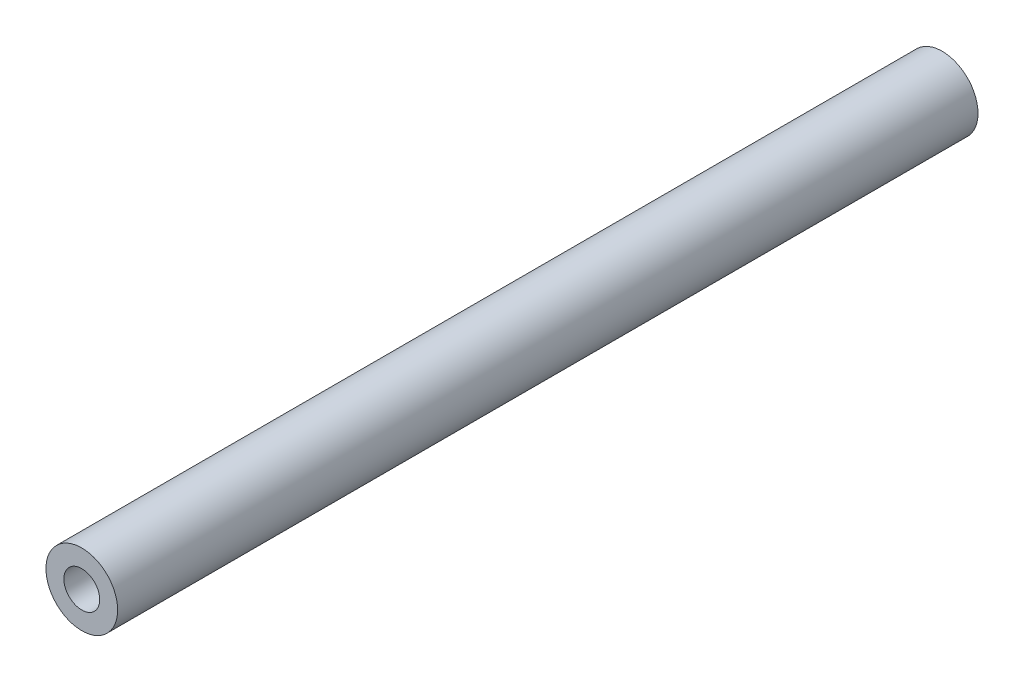
ISO-10303-21;
HEADER;
FILE_DESCRIPTION(('STEP AP214'),'2;1');
FILE_NAME('part.step','',(''),(''),'','','');
FILE_SCHEMA(('AUTOMOTIVE_DESIGN { 1 0 10303 214 1 1 1 1 }'));
ENDSEC;
DATA;
#1=APPLICATION_CONTEXT('core data for automotive mechanical design processes');
#2=APPLICATION_PROTOCOL_DEFINITION('international standard','automotive_design',2000,#1);
#3=PRODUCT_CONTEXT('',#1,'mechanical');
#4=PRODUCT('Part','Part','',(#3));
#5=PRODUCT_RELATED_PRODUCT_CATEGORY('part','',(#4));
#6=PRODUCT_DEFINITION_FORMATION('','',#4);
#7=PRODUCT_DEFINITION_CONTEXT('part definition',#1,'design');
#8=PRODUCT_DEFINITION('design','',#6,#7);
#9=PRODUCT_DEFINITION_SHAPE('','',#8);
#10=(LENGTH_UNIT() NAMED_UNIT(*) SI_UNIT(.MILLI.,.METRE.));
#11=(NAMED_UNIT(*) PLANE_ANGLE_UNIT() SI_UNIT($,.RADIAN.));
#12=(NAMED_UNIT(*) SI_UNIT($,.STERADIAN.) SOLID_ANGLE_UNIT());
#13=UNCERTAINTY_MEASURE_WITH_UNIT(LENGTH_MEASURE(1.E-05),#10,'distance_accuracy_value','');
#14=(GEOMETRIC_REPRESENTATION_CONTEXT(3) GLOBAL_UNCERTAINTY_ASSIGNED_CONTEXT((#13)) GLOBAL_UNIT_ASSIGNED_CONTEXT((#10,
#11,#12)) REPRESENTATION_CONTEXT('',''));
#15=CARTESIAN_POINT('',(0.,0.,0.));
#16=DIRECTION('',(0.,0.,1.));
#17=DIRECTION('',(1.,0.,0.));
#18=AXIS2_PLACEMENT_3D('',#15,#16,#17);
#19=CARTESIAN_POINT('',(0.,0.,100.));
#20=DIRECTION('',(0.,0.,-1.));
#21=DIRECTION('',(-1.,0.,0.));
#22=AXIS2_PLACEMENT_3D('',#19,#20,#21);
#23=CYLINDRICAL_SURFACE('',#22,10.);
#24=CARTESIAN_POINT('',(0.,0.,120.));
#25=DIRECTION('',(0.,0.,1.));
#26=DIRECTION('',(1.,0.,0.));
#27=AXIS2_PLACEMENT_3D('',#24,#25,#26);
#28=CIRCLE('',#27,10.);
#29=CARTESIAN_POINT('',(10.,0.,120.));
#30=VERTEX_POINT('',#29);
#31=EDGE_CURVE('E41',#30,#30,#28,.T.);
#32=ORIENTED_EDGE('',*,*,#31,.F.);
#33=EDGE_LOOP('',(#32));
#34=FACE_BOUND('',#33,.T.);
#35=CARTESIAN_POINT('',(0.,0.,-120.));
#36=DIRECTION('',(0.,0.,1.));
#37=DIRECTION('',(1.,0.,0.));
#38=AXIS2_PLACEMENT_3D('',#35,#36,#37);
#39=CIRCLE('',#38,10.);
#40=CARTESIAN_POINT('',(10.,0.,-120.));
#41=VERTEX_POINT('',#40);
#42=EDGE_CURVE('E50',#41,#41,#39,.T.);
#43=ORIENTED_EDGE('',*,*,#42,.T.);
#44=EDGE_LOOP('',(#43));
#45=FACE_BOUND('',#44,.T.);
#46=ADVANCED_FACE('F31',(#34,#45),#23,.T.);
#47=CARTESIAN_POINT('',(0.,0.,120.));
#48=DIRECTION('',(0.,0.,1.));
#49=DIRECTION('',(1.,0.,0.));
#50=AXIS2_PLACEMENT_3D('',#47,#48,#49);
#51=PLANE('',#50);
#52=ORIENTED_EDGE('',*,*,#31,.T.);
#53=EDGE_LOOP('',(#52));
#54=FACE_BOUND('',#53,.T.);
#55=CARTESIAN_POINT('',(0.,0.,120.));
#56=DIRECTION('',(0.,0.,1.));
#57=DIRECTION('',(1.,0.,0.));
#58=AXIS2_PLACEMENT_3D('',#55,#56,#57);
#59=CIRCLE('',#58,5.);
#60=CARTESIAN_POINT('',(5.,0.,120.));
#61=VERTEX_POINT('',#60);
#62=EDGE_CURVE('E45',#61,#61,#59,.T.);
#63=ORIENTED_EDGE('',*,*,#62,.F.);
#64=EDGE_LOOP('',(#63));
#65=FACE_BOUND('',#64,.T.);
#66=ADVANCED_FACE('F72',(#54,#65),#51,.T.);
#67=CARTESIAN_POINT('',(0.,0.,120.));
#68=DIRECTION('',(0.,0.,-1.));
#69=DIRECTION('',(-1.,0.,0.));
#70=AXIS2_PLACEMENT_3D('',#67,#68,#69);
#71=CYLINDRICAL_SURFACE('',#70,5.);
#72=ORIENTED_EDGE('',*,*,#62,.T.);
#73=EDGE_LOOP('',(#72));
#74=FACE_BOUND('',#73,.T.);
#75=CARTESIAN_POINT('',(0.,0.,100.));
#76=DIRECTION('',(0.,0.,1.));
#77=DIRECTION('',(1.,0.,0.));
#78=AXIS2_PLACEMENT_3D('',#75,#76,#77);
#79=CIRCLE('',#78,5.);
#80=CARTESIAN_POINT('',(5.,0.,100.));
#81=VERTEX_POINT('',#80);
#82=EDGE_CURVE('E37',#81,#81,#79,.F.);
#83=ORIENTED_EDGE('',*,*,#82,.T.);
#84=EDGE_LOOP('',(#83));
#85=FACE_BOUND('',#84,.T.);
#86=ADVANCED_FACE('F77',(#74,#85),#71,.F.);
#87=CARTESIAN_POINT('',(0.,0.,100.));
#88=DIRECTION('',(0.,0.,1.));
#89=DIRECTION('',(1.,0.,0.));
#90=AXIS2_PLACEMENT_3D('',#87,#88,#89);
#91=PLANE('',#90);
#92=ORIENTED_EDGE('',*,*,#82,.F.);
#93=EDGE_LOOP('',(#92));
#94=FACE_BOUND('',#93,.T.);
#95=ADVANCED_FACE('F69',(#94),#91,.T.);
#96=CARTESIAN_POINT('',(0.,0.,-120.));
#97=DIRECTION('',(0.,0.,-1.));
#98=DIRECTION('',(1.,0.,0.));
#99=AXIS2_PLACEMENT_3D('',#96,#97,#98);
#100=PLANE('',#99);
#101=CARTESIAN_POINT('',(0.,0.,-120.));
#102=DIRECTION('',(0.,0.,1.));
#103=DIRECTION('',(1.,0.,0.));
#104=AXIS2_PLACEMENT_3D('',#101,#102,#103);
#105=CIRCLE('',#104,5.);
#106=CARTESIAN_POINT('',(5.,0.,-120.));
#107=VERTEX_POINT('',#106);
#108=EDGE_CURVE('E53',#107,#107,#105,.T.);
#109=ORIENTED_EDGE('',*,*,#108,.T.);
#110=EDGE_LOOP('',(#109));
#111=FACE_BOUND('',#110,.T.);
#112=ORIENTED_EDGE('',*,*,#42,.F.);
#113=EDGE_LOOP('',(#112));
#114=FACE_BOUND('',#113,.T.);
#115=ADVANCED_FACE('F57',(#111,#114),#100,.T.);
#116=CARTESIAN_POINT('',(0.,0.,-120.));
#117=DIRECTION('',(0.,0.,1.));
#118=DIRECTION('',(1.,0.,0.));
#119=AXIS2_PLACEMENT_3D('',#116,#117,#118);
#120=CYLINDRICAL_SURFACE('',#119,5.);
#121=ORIENTED_EDGE('',*,*,#108,.F.);
#122=EDGE_LOOP('',(#121));
#123=FACE_BOUND('',#122,.T.);
#124=CARTESIAN_POINT('',(0.,0.,-100.));
#125=DIRECTION('',(0.,0.,1.));
#126=DIRECTION('',(1.,0.,0.));
#127=AXIS2_PLACEMENT_3D('',#124,#125,#126);
#128=CIRCLE('',#127,5.);
#129=CARTESIAN_POINT('',(5.,0.,-100.));
#130=VERTEX_POINT('',#129);
#131=EDGE_CURVE('E10',#130,#130,#128,.T.);
#132=ORIENTED_EDGE('',*,*,#131,.T.);
#133=EDGE_LOOP('',(#132));
#134=FACE_BOUND('',#133,.T.);
#135=ADVANCED_FACE('F60',(#123,#134),#120,.F.);
#136=CARTESIAN_POINT('',(0.,0.,-100.));
#137=DIRECTION('',(0.,0.,1.));
#138=DIRECTION('',(1.,0.,0.));
#139=AXIS2_PLACEMENT_3D('',#136,#137,#138);
#140=PLANE('',#139);
#141=ORIENTED_EDGE('',*,*,#131,.F.);
#142=EDGE_LOOP('',(#141));
#143=FACE_BOUND('',#142,.T.);
#144=ADVANCED_FACE('F62',(#143),#140,.F.);
#145=CLOSED_SHELL('',(#46,#66,#86,#95,#115,#135,#144));
#146=MANIFOLD_SOLID_BREP('B2',#145);
#147=ADVANCED_BREP_SHAPE_REPRESENTATION('',(#18,#146),#14);
#148=SHAPE_DEFINITION_REPRESENTATION(#9,#147);
ENDSEC;
END-ISO-10303-21;
